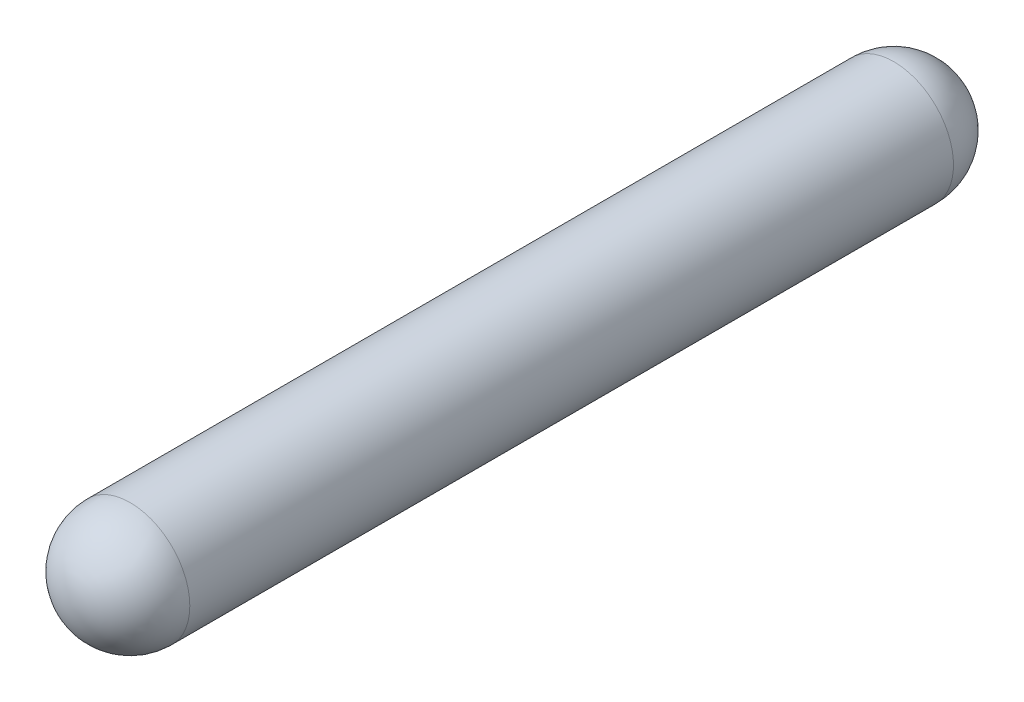
ISO-10303-21;
HEADER;
FILE_DESCRIPTION(('STEP AP214'),'2;1');
FILE_NAME('part.step','',(''),(''),'','','');
FILE_SCHEMA(('AUTOMOTIVE_DESIGN { 1 0 10303 214 1 1 1 1 }'));
ENDSEC;
DATA;
#1=APPLICATION_CONTEXT('core data for automotive mechanical design processes');
#2=APPLICATION_PROTOCOL_DEFINITION('international standard','automotive_design',2000,#1);
#3=PRODUCT_CONTEXT('',#1,'mechanical');
#4=PRODUCT('Part','Part','',(#3));
#5=PRODUCT_RELATED_PRODUCT_CATEGORY('part','',(#4));
#6=PRODUCT_DEFINITION_FORMATION('','',#4);
#7=PRODUCT_DEFINITION_CONTEXT('part definition',#1,'design');
#8=PRODUCT_DEFINITION('design','',#6,#7);
#9=PRODUCT_DEFINITION_SHAPE('','',#8);
#10=(LENGTH_UNIT() NAMED_UNIT(*) SI_UNIT(.MILLI.,.METRE.));
#11=(NAMED_UNIT(*) PLANE_ANGLE_UNIT() SI_UNIT($,.RADIAN.));
#12=(NAMED_UNIT(*) SI_UNIT($,.STERADIAN.) SOLID_ANGLE_UNIT());
#13=UNCERTAINTY_MEASURE_WITH_UNIT(LENGTH_MEASURE(1.E-05),#10,'distance_accuracy_value','');
#14=(GEOMETRIC_REPRESENTATION_CONTEXT(3) GLOBAL_UNCERTAINTY_ASSIGNED_CONTEXT((#13)) GLOBAL_UNIT_ASSIGNED_CONTEXT((#10,
#11,#12)) REPRESENTATION_CONTEXT('',''));
#15=CARTESIAN_POINT('',(0.,0.,0.));
#16=DIRECTION('',(0.,0.,1.));
#17=DIRECTION('',(1.,0.,0.));
#18=AXIS2_PLACEMENT_3D('',#15,#16,#17);
#19=CARTESIAN_POINT('',(0.,0.,34.5));
#20=DIRECTION('',(0.,0.,-1.));
#21=DIRECTION('',(1.,0.,0.));
#22=AXIS2_PLACEMENT_3D('',#19,#20,#21);
#23=SPHERICAL_SURFACE('',#22,2.5);
#24=CARTESIAN_POINT('',(0.,0.,34.5));
#25=DIRECTION('',(0.,0.,-1.));
#26=DIRECTION('',(-1.,0.,0.));
#27=AXIS2_PLACEMENT_3D('',#24,#25,#26);
#28=CIRCLE('',#27,2.5);
#29=CARTESIAN_POINT('',(-2.5,0.,34.5));
#30=VERTEX_POINT('',#29);
#31=EDGE_CURVE('E37',#30,#30,#28,.T.);
#32=ORIENTED_EDGE('',*,*,#31,.F.);
#33=EDGE_LOOP('',(#32));
#34=FACE_BOUND('',#33,.T.);
#35=ADVANCED_FACE('F31',(#34),#23,.T.);
#36=CARTESIAN_POINT('',(0.,0.,2.5));
#37=DIRECTION('',(0.,0.,-1.));
#38=DIRECTION('',(-1.,0.,0.));
#39=AXIS2_PLACEMENT_3D('',#36,#37,#38);
#40=SPHERICAL_SURFACE('',#39,2.5);
#41=CARTESIAN_POINT('',(0.,0.,2.5));
#42=DIRECTION('',(0.,0.,-1.));
#43=DIRECTION('',(-1.,0.,0.));
#44=AXIS2_PLACEMENT_3D('',#41,#42,#43);
#45=CIRCLE('',#44,2.5);
#46=CARTESIAN_POINT('',(-2.5,0.,2.5));
#47=VERTEX_POINT('',#46);
#48=EDGE_CURVE('E10',#47,#47,#45,.T.);
#49=ORIENTED_EDGE('',*,*,#48,.T.);
#50=EDGE_LOOP('',(#49));
#51=FACE_BOUND('',#50,.T.);
#52=ADVANCED_FACE('F47',(#51),#40,.T.);
#53=CARTESIAN_POINT('',(0.,0.,37.));
#54=DIRECTION('',(0.,0.,-1.));
#55=DIRECTION('',(-1.,0.,0.));
#56=AXIS2_PLACEMENT_3D('',#53,#54,#55);
#57=CYLINDRICAL_SURFACE('',#56,2.5);
#58=ORIENTED_EDGE('',*,*,#31,.T.);
#59=EDGE_LOOP('',(#58));
#60=FACE_BOUND('',#59,.T.);
#61=ORIENTED_EDGE('',*,*,#48,.F.);
#62=EDGE_LOOP('',(#61));
#63=FACE_BOUND('',#62,.T.);
#64=ADVANCED_FACE('F43',(#60,#63),#57,.T.);
#65=CLOSED_SHELL('',(#35,#52,#64));
#66=MANIFOLD_SOLID_BREP('B2',#65);
#67=ADVANCED_BREP_SHAPE_REPRESENTATION('',(#18,#66),#14);
#68=SHAPE_DEFINITION_REPRESENTATION(#9,#67);
ENDSEC;
END-ISO-10303-21;
